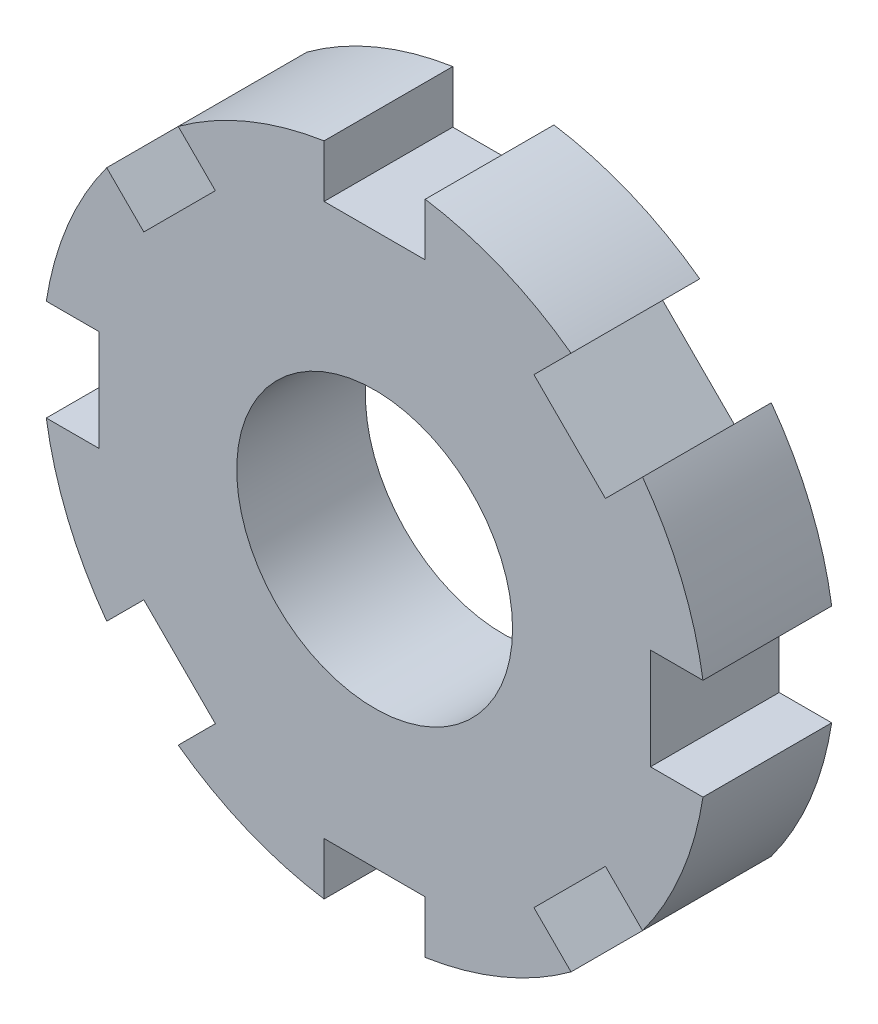
ISO-10303-21;
HEADER;
FILE_DESCRIPTION(('STEP AP214'),'2;1');
FILE_NAME('part.step','',(''),(''),'','','');
FILE_SCHEMA(('AUTOMOTIVE_DESIGN { 1 0 10303 214 1 1 1 1 }'));
ENDSEC;
DATA;
#1=APPLICATION_CONTEXT('core data for automotive mechanical design processes');
#2=APPLICATION_PROTOCOL_DEFINITION('international standard','automotive_design',2000,#1);
#3=PRODUCT_CONTEXT('',#1,'mechanical');
#4=PRODUCT('Part','Part','',(#3));
#5=PRODUCT_RELATED_PRODUCT_CATEGORY('part','',(#4));
#6=PRODUCT_DEFINITION_FORMATION('','',#4);
#7=PRODUCT_DEFINITION_CONTEXT('part definition',#1,'design');
#8=PRODUCT_DEFINITION('design','',#6,#7);
#9=PRODUCT_DEFINITION_SHAPE('','',#8);
#10=(LENGTH_UNIT() NAMED_UNIT(*) SI_UNIT(.MILLI.,.METRE.));
#11=(NAMED_UNIT(*) PLANE_ANGLE_UNIT() SI_UNIT($,.RADIAN.));
#12=(NAMED_UNIT(*) SI_UNIT($,.STERADIAN.) SOLID_ANGLE_UNIT());
#13=UNCERTAINTY_MEASURE_WITH_UNIT(LENGTH_MEASURE(1.E-05),#10,'distance_accuracy_value','');
#14=(GEOMETRIC_REPRESENTATION_CONTEXT(3) GLOBAL_UNCERTAINTY_ASSIGNED_CONTEXT((#13)) GLOBAL_UNIT_ASSIGNED_CONTEXT((#10,
#11,#12)) REPRESENTATION_CONTEXT('',''));
#15=CARTESIAN_POINT('',(0.,0.,0.));
#16=DIRECTION('',(0.,0.,1.));
#17=DIRECTION('',(1.,0.,0.));
#18=AXIS2_PLACEMENT_3D('',#15,#16,#17);
#19=CARTESIAN_POINT('',(5.5,0.,14.));
#20=DIRECTION('',(1.,0.,0.));
#21=DIRECTION('',(0.,1.,0.));
#22=AXIS2_PLACEMENT_3D('',#19,#20,#21);
#23=PLANE('',#22);
#24=DIRECTION('',(0.,0.,1.));
#25=VECTOR('',#24,1.);
#26=CARTESIAN_POINT('',(5.5,-5.70889244992067,0.));
#27=LINE('',#26,#25);
#28=CARTESIAN_POINT('',(5.5,-5.70889244992067,14.));
#29=VERTEX_POINT('',#28);
#30=CARTESIAN_POINT('',(5.5,-5.70889244992067,0.));
#31=VERTEX_POINT('',#30);
#32=EDGE_CURVE('E495',#29,#31,#27,.F.);
#33=ORIENTED_EDGE('',*,*,#32,.F.);
#34=DIRECTION('',(0.,-1.,0.));
#35=VECTOR('',#34,1.);
#36=CARTESIAN_POINT('',(5.5,0.,14.));
#37=LINE('',#36,#35);
#38=CARTESIAN_POINT('',(5.5,0.,14.));
#39=VERTEX_POINT('',#38);
#40=EDGE_CURVE('E305',#39,#29,#37,.T.);
#41=ORIENTED_EDGE('',*,*,#40,.F.);
#42=DIRECTION('',(0.,0.,-1.));
#43=VECTOR('',#42,1.);
#44=CARTESIAN_POINT('',(5.5,0.,14.));
#45=LINE('',#44,#43);
#46=CARTESIAN_POINT('',(5.5,0.,0.));
#47=VERTEX_POINT('',#46);
#48=EDGE_CURVE('E306',#39,#47,#45,.T.);
#49=ORIENTED_EDGE('',*,*,#48,.T.);
#50=DIRECTION('',(0.,-1.,0.));
#51=VECTOR('',#50,1.);
#52=CARTESIAN_POINT('',(5.5,0.,0.));
#53=LINE('',#52,#51);
#54=EDGE_CURVE('E432',#47,#31,#53,.T.);
#55=ORIENTED_EDGE('',*,*,#54,.T.);
#56=EDGE_LOOP('',(#33,#41,#49,#55));
#57=FACE_BOUND('',#56,.T.);
#58=ADVANCED_FACE('F32',(#57),#23,.F.);
#59=CARTESIAN_POINT('',(30.,24.5,14.));
#60=DIRECTION('',(0.,-1.,0.));
#61=DIRECTION('',(1.,0.,0.));
#62=AXIS2_PLACEMENT_3D('',#59,#60,#61);
#63=PLANE('',#62);
#64=DIRECTION('',(0.,0.,1.));
#65=VECTOR('',#64,1.);
#66=CARTESIAN_POINT('',(35.7088924499207,24.5,0.));
#67=LINE('',#66,#65);
#68=CARTESIAN_POINT('',(35.7088924499207,24.5,0.));
#69=VERTEX_POINT('',#68);
#70=CARTESIAN_POINT('',(35.7088924499207,24.5,14.));
#71=VERTEX_POINT('',#70);
#72=EDGE_CURVE('E493',#69,#71,#67,.T.);
#73=ORIENTED_EDGE('',*,*,#72,.F.);
#74=DIRECTION('',(-1.,0.,0.));
#75=VECTOR('',#74,1.);
#76=CARTESIAN_POINT('',(30.,24.5,0.));
#77=LINE('',#76,#75);
#78=CARTESIAN_POINT('',(30.,24.5,0.));
#79=VERTEX_POINT('',#78);
#80=EDGE_CURVE('E443',#69,#79,#77,.T.);
#81=ORIENTED_EDGE('',*,*,#80,.T.);
#82=DIRECTION('',(0.,0.,-1.));
#83=VECTOR('',#82,1.);
#84=CARTESIAN_POINT('',(30.,24.5,14.));
#85=LINE('',#84,#83);
#86=CARTESIAN_POINT('',(30.,24.5,14.));
#87=VERTEX_POINT('',#86);
#88=EDGE_CURVE('E355',#87,#79,#85,.T.);
#89=ORIENTED_EDGE('',*,*,#88,.F.);
#90=DIRECTION('',(-1.,0.,0.));
#91=VECTOR('',#90,1.);
#92=CARTESIAN_POINT('',(30.,24.5,14.));
#93=LINE('',#92,#91);
#94=EDGE_CURVE('E460',#71,#87,#93,.T.);
#95=ORIENTED_EDGE('',*,*,#94,.F.);
#96=EDGE_LOOP('',(#73,#81,#89,#95));
#97=FACE_BOUND('',#96,.T.);
#98=ADVANCED_FACE('F513',(#97),#63,.F.);
#99=CARTESIAN_POINT('',(30.,35.5,14.));
#100=DIRECTION('',(0.,1.,0.));
#101=DIRECTION('',(-1.,0.,0.));
#102=AXIS2_PLACEMENT_3D('',#99,#100,#101);
#103=PLANE('',#102);
#104=DIRECTION('',(0.,0.,1.));
#105=VECTOR('',#104,1.);
#106=CARTESIAN_POINT('',(35.7088924499207,35.5,0.));
#107=LINE('',#106,#105);
#108=CARTESIAN_POINT('',(35.7088924499207,35.5,14.));
#109=VERTEX_POINT('',#108);
#110=CARTESIAN_POINT('',(35.7088924499207,35.5,0.));
#111=VERTEX_POINT('',#110);
#112=EDGE_CURVE('E47',#109,#111,#107,.F.);
#113=ORIENTED_EDGE('',*,*,#112,.F.);
#114=DIRECTION('',(1.,0.,0.));
#115=VECTOR('',#114,1.);
#116=CARTESIAN_POINT('',(30.,35.5,14.));
#117=LINE('',#116,#115);
#118=CARTESIAN_POINT('',(30.,35.5,14.));
#119=VERTEX_POINT('',#118);
#120=EDGE_CURVE('E455',#119,#109,#117,.T.);
#121=ORIENTED_EDGE('',*,*,#120,.F.);
#122=DIRECTION('',(0.,0.,-1.));
#123=VECTOR('',#122,1.);
#124=CARTESIAN_POINT('',(30.,35.5,14.));
#125=LINE('',#124,#123);
#126=CARTESIAN_POINT('',(30.,35.5,0.));
#127=VERTEX_POINT('',#126);
#128=EDGE_CURVE('E256',#119,#127,#125,.T.);
#129=ORIENTED_EDGE('',*,*,#128,.T.);
#130=DIRECTION('',(1.,0.,0.));
#131=VECTOR('',#130,1.);
#132=CARTESIAN_POINT('',(30.,35.5,0.));
#133=LINE('',#132,#131);
#134=EDGE_CURVE('E263',#127,#111,#133,.T.);
#135=ORIENTED_EDGE('',*,*,#134,.T.);
#136=EDGE_LOOP('',(#113,#121,#129,#135));
#137=FACE_BOUND('',#136,.T.);
#138=ADVANCED_FACE('F453',(#137),#103,.F.);
#139=CARTESIAN_POINT('',(5.50000000000001,60.,14.));
#140=DIRECTION('',(1.,0.,0.));
#141=DIRECTION('',(0.,1.,0.));
#142=AXIS2_PLACEMENT_3D('',#139,#140,#141);
#143=PLANE('',#142);
#144=DIRECTION('',(0.,0.,1.));
#145=VECTOR('',#144,1.);
#146=CARTESIAN_POINT('',(5.5,65.7088924499207,0.));
#147=LINE('',#146,#145);
#148=CARTESIAN_POINT('',(5.5,65.7088924499207,0.));
#149=VERTEX_POINT('',#148);
#150=CARTESIAN_POINT('',(5.5,65.7088924499207,14.));
#151=VERTEX_POINT('',#150);
#152=EDGE_CURVE('E490',#149,#151,#147,.T.);
#153=ORIENTED_EDGE('',*,*,#152,.F.);
#154=DIRECTION('',(0.,-1.,0.));
#155=VECTOR('',#154,1.);
#156=CARTESIAN_POINT('',(5.50000000000001,60.,0.));
#157=LINE('',#156,#155);
#158=CARTESIAN_POINT('',(5.50000000000001,60.,0.));
#159=VERTEX_POINT('',#158);
#160=EDGE_CURVE('E273',#149,#159,#157,.T.);
#161=ORIENTED_EDGE('',*,*,#160,.T.);
#162=DIRECTION('',(0.,0.,-1.));
#163=VECTOR('',#162,1.);
#164=CARTESIAN_POINT('',(5.50000000000001,60.,14.));
#165=LINE('',#164,#163);
#166=CARTESIAN_POINT('',(5.50000000000001,60.,14.));
#167=VERTEX_POINT('',#166);
#168=EDGE_CURVE('E344',#167,#159,#165,.T.);
#169=ORIENTED_EDGE('',*,*,#168,.F.);
#170=DIRECTION('',(0.,-1.,0.));
#171=VECTOR('',#170,1.);
#172=CARTESIAN_POINT('',(5.50000000000001,60.,14.));
#173=LINE('',#172,#171);
#174=EDGE_CURVE('E468',#151,#167,#173,.T.);
#175=ORIENTED_EDGE('',*,*,#174,.F.);
#176=EDGE_LOOP('',(#153,#161,#169,#175));
#177=FACE_BOUND('',#176,.T.);
#178=ADVANCED_FACE('F582',(#177),#143,.F.);
#179=CARTESIAN_POINT('',(-5.50000000000001,60.,14.));
#180=DIRECTION('',(-1.,0.,0.));
#181=DIRECTION('',(0.,-1.,0.));
#182=AXIS2_PLACEMENT_3D('',#179,#180,#181);
#183=PLANE('',#182);
#184=DIRECTION('',(0.,0.,1.));
#185=VECTOR('',#184,1.);
#186=CARTESIAN_POINT('',(-5.5,65.7088924499207,0.));
#187=LINE('',#186,#185);
#188=CARTESIAN_POINT('',(-5.5,65.7088924499207,14.));
#189=VERTEX_POINT('',#188);
#190=CARTESIAN_POINT('',(-5.5,65.7088924499207,0.));
#191=VERTEX_POINT('',#190);
#192=EDGE_CURVE('E55',#189,#191,#187,.F.);
#193=ORIENTED_EDGE('',*,*,#192,.F.);
#194=DIRECTION('',(0.,1.,0.));
#195=VECTOR('',#194,1.);
#196=CARTESIAN_POINT('',(-5.50000000000001,60.,14.));
#197=LINE('',#196,#195);
#198=CARTESIAN_POINT('',(-5.50000000000001,60.,14.));
#199=VERTEX_POINT('',#198);
#200=EDGE_CURVE('E472',#199,#189,#197,.T.);
#201=ORIENTED_EDGE('',*,*,#200,.F.);
#202=DIRECTION('',(0.,0.,-1.));
#203=VECTOR('',#202,1.);
#204=CARTESIAN_POINT('',(-5.50000000000001,60.,14.));
#205=LINE('',#204,#203);
#206=CARTESIAN_POINT('',(-5.50000000000001,60.,0.));
#207=VERTEX_POINT('',#206);
#208=EDGE_CURVE('E341',#199,#207,#205,.T.);
#209=ORIENTED_EDGE('',*,*,#208,.T.);
#210=DIRECTION('',(0.,1.,0.));
#211=VECTOR('',#210,1.);
#212=CARTESIAN_POINT('',(-5.50000000000001,60.,0.));
#213=LINE('',#212,#211);
#214=EDGE_CURVE('E277',#207,#191,#213,.T.);
#215=ORIENTED_EDGE('',*,*,#214,.T.);
#216=EDGE_LOOP('',(#193,#201,#209,#215));
#217=FACE_BOUND('',#216,.T.);
#218=ADVANCED_FACE('F622',(#217),#183,.F.);
#219=CARTESIAN_POINT('',(-30.,35.5,14.));
#220=DIRECTION('',(0.,1.,0.));
#221=DIRECTION('',(-1.,0.,0.));
#222=AXIS2_PLACEMENT_3D('',#219,#220,#221);
#223=PLANE('',#222);
#224=DIRECTION('',(0.,0.,1.));
#225=VECTOR('',#224,1.);
#226=CARTESIAN_POINT('',(-35.7088924499207,35.5,0.));
#227=LINE('',#226,#225);
#228=CARTESIAN_POINT('',(-35.7088924499207,35.5,0.));
#229=VERTEX_POINT('',#228);
#230=CARTESIAN_POINT('',(-35.7088924499207,35.5,14.));
#231=VERTEX_POINT('',#230);
#232=EDGE_CURVE('E487',#229,#231,#227,.T.);
#233=ORIENTED_EDGE('',*,*,#232,.F.);
#234=DIRECTION('',(1.,0.,0.));
#235=VECTOR('',#234,1.);
#236=CARTESIAN_POINT('',(-30.,35.5,0.));
#237=LINE('',#236,#235);
#238=CARTESIAN_POINT('',(-30.,35.5,0.));
#239=VERTEX_POINT('',#238);
#240=EDGE_CURVE('E287',#229,#239,#237,.T.);
#241=ORIENTED_EDGE('',*,*,#240,.T.);
#242=DIRECTION('',(0.,0.,-1.));
#243=VECTOR('',#242,1.);
#244=CARTESIAN_POINT('',(-30.,35.5,14.));
#245=LINE('',#244,#243);
#246=CARTESIAN_POINT('',(-30.,35.5,14.));
#247=VERTEX_POINT('',#246);
#248=EDGE_CURVE('E327',#247,#239,#245,.T.);
#249=ORIENTED_EDGE('',*,*,#248,.F.);
#250=DIRECTION('',(1.,0.,0.));
#251=VECTOR('',#250,1.);
#252=CARTESIAN_POINT('',(-30.,35.5,14.));
#253=LINE('',#252,#251);
#254=EDGE_CURVE('E410',#231,#247,#253,.T.);
#255=ORIENTED_EDGE('',*,*,#254,.F.);
#256=EDGE_LOOP('',(#233,#241,#249,#255));
#257=FACE_BOUND('',#256,.T.);
#258=ADVANCED_FACE('F615',(#257),#223,.F.);
#259=CARTESIAN_POINT('',(-30.,24.5,14.));
#260=DIRECTION('',(0.,-1.,0.));
#261=DIRECTION('',(1.,0.,0.));
#262=AXIS2_PLACEMENT_3D('',#259,#260,#261);
#263=PLANE('',#262);
#264=DIRECTION('',(0.,0.,1.));
#265=VECTOR('',#264,1.);
#266=CARTESIAN_POINT('',(-35.7088924499207,24.5,0.));
#267=LINE('',#266,#265);
#268=CARTESIAN_POINT('',(-35.7088924499207,24.5,14.));
#269=VERTEX_POINT('',#268);
#270=CARTESIAN_POINT('',(-35.7088924499207,24.5,0.));
#271=VERTEX_POINT('',#270);
#272=EDGE_CURVE('E485',#269,#271,#267,.F.);
#273=ORIENTED_EDGE('',*,*,#272,.F.);
#274=DIRECTION('',(-1.,0.,0.));
#275=VECTOR('',#274,1.);
#276=CARTESIAN_POINT('',(-30.,24.5,14.));
#277=LINE('',#276,#275);
#278=CARTESIAN_POINT('',(-30.,24.5,14.));
#279=VERTEX_POINT('',#278);
#280=EDGE_CURVE('E419',#279,#269,#277,.T.);
#281=ORIENTED_EDGE('',*,*,#280,.F.);
#282=DIRECTION('',(0.,0.,-1.));
#283=VECTOR('',#282,1.);
#284=CARTESIAN_POINT('',(-30.,24.5,14.));
#285=LINE('',#284,#283);
#286=CARTESIAN_POINT('',(-30.,24.5,0.));
#287=VERTEX_POINT('',#286);
#288=EDGE_CURVE('E324',#279,#287,#285,.T.);
#289=ORIENTED_EDGE('',*,*,#288,.T.);
#290=DIRECTION('',(-1.,0.,0.));
#291=VECTOR('',#290,1.);
#292=CARTESIAN_POINT('',(-30.,24.5,0.));
#293=LINE('',#292,#291);
#294=EDGE_CURVE('E291',#287,#271,#293,.T.);
#295=ORIENTED_EDGE('',*,*,#294,.T.);
#296=EDGE_LOOP('',(#273,#281,#289,#295));
#297=FACE_BOUND('',#296,.T.);
#298=ADVANCED_FACE('F605',(#297),#263,.F.);
#299=CARTESIAN_POINT('',(-5.49999999999998,0.,14.));
#300=DIRECTION('',(-1.,0.,0.));
#301=DIRECTION('',(0.,-1.,0.));
#302=AXIS2_PLACEMENT_3D('',#299,#300,#301);
#303=PLANE('',#302);
#304=DIRECTION('',(0.,0.,1.));
#305=VECTOR('',#304,1.);
#306=CARTESIAN_POINT('',(-5.49999999999998,-5.70889244992067,0.));
#307=LINE('',#306,#305);
#308=CARTESIAN_POINT('',(-5.49999999999998,-5.70889244992067,0.));
#309=VERTEX_POINT('',#308);
#310=CARTESIAN_POINT('',(-5.49999999999998,-5.70889244992067,14.));
#311=VERTEX_POINT('',#310);
#312=EDGE_CURVE('E246',#309,#311,#307,.T.);
#313=ORIENTED_EDGE('',*,*,#312,.F.);
#314=DIRECTION('',(0.,1.,0.));
#315=VECTOR('',#314,1.);
#316=CARTESIAN_POINT('',(-5.49999999999998,0.,0.));
#317=LINE('',#316,#315);
#318=CARTESIAN_POINT('',(-5.49999999999998,0.,0.));
#319=VERTEX_POINT('',#318);
#320=EDGE_CURVE('E301',#309,#319,#317,.T.);
#321=ORIENTED_EDGE('',*,*,#320,.T.);
#322=DIRECTION('',(0.,0.,-1.));
#323=VECTOR('',#322,1.);
#324=CARTESIAN_POINT('',(-5.49999999999998,0.,14.));
#325=LINE('',#324,#323);
#326=CARTESIAN_POINT('',(-5.49999999999998,0.,14.));
#327=VERTEX_POINT('',#326);
#328=EDGE_CURVE('E309',#327,#319,#325,.T.);
#329=ORIENTED_EDGE('',*,*,#328,.F.);
#330=DIRECTION('',(0.,1.,0.));
#331=VECTOR('',#330,1.);
#332=CARTESIAN_POINT('',(-5.49999999999998,0.,14.));
#333=LINE('',#332,#331);
#334=EDGE_CURVE('E429',#311,#327,#333,.T.);
#335=ORIENTED_EDGE('',*,*,#334,.F.);
#336=EDGE_LOOP('',(#313,#321,#329,#335));
#337=FACE_BOUND('',#336,.T.);
#338=ADVANCED_FACE('F557',(#337),#303,.F.);
#339=CARTESIAN_POINT('',(0.,0.,14.));
#340=DIRECTION('',(0.,0.,1.));
#341=DIRECTION('',(1.,0.,0.));
#342=AXIS2_PLACEMENT_3D('',#339,#340,#341);
#343=PLANE('',#342);
#344=CARTESIAN_POINT('',(0.,30.,14.));
#345=DIRECTION('',(0.,0.,1.));
#346=DIRECTION('',(1.,0.,0.));
#347=AXIS2_PLACEMENT_3D('',#344,#345,#346);
#348=CIRCLE('',#347,15.);
#349=CARTESIAN_POINT('',(15.,30.,14.));
#350=VERTEX_POINT('',#349);
#351=EDGE_CURVE('E436',#350,#350,#348,.T.);
#352=ORIENTED_EDGE('',*,*,#351,.F.);
#353=EDGE_LOOP('',(#352));
#354=FACE_BOUND('',#353,.T.);
#355=ORIENTED_EDGE('',*,*,#120,.T.);
#356=CARTESIAN_POINT('',(0.,30.,14.));
#357=DIRECTION('',(0.,0.,1.));
#358=DIRECTION('',(1.,0.,0.));
#359=AXIS2_PLACEMENT_3D('',#356,#357,#358);
#360=CIRCLE('',#359,36.1299737060519);
#361=CARTESIAN_POINT('',(29.139087296526,51.360912703474,14.));
#362=VERTEX_POINT('',#361);
#363=EDGE_CURVE('E247',#109,#362,#360,.T.);
#364=ORIENTED_EDGE('',*,*,#363,.T.);
#365=DIRECTION('',(-0.707106781186547,-0.707106781186548,0.));
#366=VECTOR('',#365,1.);
#367=CARTESIAN_POINT('',(29.139087296526,51.360912703474,14.));
#368=LINE('',#367,#366);
#369=CARTESIAN_POINT('',(25.1022907321224,47.3241161390704,14.));
#370=VERTEX_POINT('',#369);
#371=EDGE_CURVE('E255',#362,#370,#368,.T.);
#372=ORIENTED_EDGE('',*,*,#371,.T.);
#373=DIRECTION('',(-0.707106781186548,0.707106781186547,0.));
#374=VECTOR('',#373,1.);
#375=CARTESIAN_POINT('',(17.3241161390704,55.1022907321224,14.));
#376=LINE('',#375,#374);
#377=CARTESIAN_POINT('',(17.3241161390704,55.1022907321224,14.));
#378=VERTEX_POINT('',#377);
#379=EDGE_CURVE('E458',#370,#378,#376,.T.);
#380=ORIENTED_EDGE('',*,*,#379,.T.);
#381=DIRECTION('',(0.707106781186548,0.707106781186547,0.));
#382=VECTOR('',#381,1.);
#383=CARTESIAN_POINT('',(21.360912703474,59.139087296526,14.));
#384=LINE('',#383,#382);
#385=CARTESIAN_POINT('',(21.360912703474,59.139087296526,14.));
#386=VERTEX_POINT('',#385);
#387=EDGE_CURVE('E465',#378,#386,#384,.T.);
#388=ORIENTED_EDGE('',*,*,#387,.T.);
#389=EDGE_CURVE('E477',#386,#151,#360,.T.);
#390=ORIENTED_EDGE('',*,*,#389,.T.);
#391=ORIENTED_EDGE('',*,*,#174,.T.);
#392=DIRECTION('',(-1.,0.,0.));
#393=VECTOR('',#392,1.);
#394=CARTESIAN_POINT('',(-5.50000000000001,60.,14.));
#395=LINE('',#394,#393);
#396=EDGE_CURVE('E470',#167,#199,#395,.T.);
#397=ORIENTED_EDGE('',*,*,#396,.T.);
#398=ORIENTED_EDGE('',*,*,#200,.T.);
#399=CARTESIAN_POINT('',(-21.360912703474,59.139087296526,14.));
#400=VERTEX_POINT('',#399);
#401=EDGE_CURVE('E475',#189,#400,#360,.T.);
#402=ORIENTED_EDGE('',*,*,#401,.T.);
#403=DIRECTION('',(0.707106781186548,-0.707106781186547,0.));
#404=VECTOR('',#403,1.);
#405=CARTESIAN_POINT('',(-21.360912703474,59.139087296526,14.));
#406=LINE('',#405,#404);
#407=CARTESIAN_POINT('',(-17.3241161390704,55.1022907321224,14.));
#408=VERTEX_POINT('',#407);
#409=EDGE_CURVE('E395',#400,#408,#406,.T.);
#410=ORIENTED_EDGE('',*,*,#409,.T.);
#411=DIRECTION('',(-0.707106781186548,-0.707106781186547,0.));
#412=VECTOR('',#411,1.);
#413=CARTESIAN_POINT('',(-17.3241161390704,55.1022907321224,14.));
#414=LINE('',#413,#412);
#415=CARTESIAN_POINT('',(-25.1022907321224,47.3241161390704,14.));
#416=VERTEX_POINT('',#415);
#417=EDGE_CURVE('E411',#408,#416,#414,.T.);
#418=ORIENTED_EDGE('',*,*,#417,.T.);
#419=DIRECTION('',(-0.707106781186547,0.707106781186548,0.));
#420=VECTOR('',#419,1.);
#421=CARTESIAN_POINT('',(-29.139087296526,51.360912703474,14.));
#422=LINE('',#421,#420);
#423=CARTESIAN_POINT('',(-29.139087296526,51.360912703474,14.));
#424=VERTEX_POINT('',#423);
#425=EDGE_CURVE('E407',#416,#424,#422,.T.);
#426=ORIENTED_EDGE('',*,*,#425,.T.);
#427=EDGE_CURVE('E478',#424,#231,#360,.T.);
#428=ORIENTED_EDGE('',*,*,#427,.T.);
#429=ORIENTED_EDGE('',*,*,#254,.T.);
#430=DIRECTION('',(0.,-1.,0.));
#431=VECTOR('',#430,1.);
#432=CARTESIAN_POINT('',(-30.,35.5,14.));
#433=LINE('',#432,#431);
#434=EDGE_CURVE('E413',#247,#279,#433,.T.);
#435=ORIENTED_EDGE('',*,*,#434,.T.);
#436=ORIENTED_EDGE('',*,*,#280,.T.);
#437=CARTESIAN_POINT('',(-29.139087296526,8.63908729652599,14.));
#438=VERTEX_POINT('',#437);
#439=EDGE_CURVE('E481',#269,#438,#360,.T.);
#440=ORIENTED_EDGE('',*,*,#439,.T.);
#441=DIRECTION('',(0.707106781186547,0.707106781186548,0.));
#442=VECTOR('',#441,1.);
#443=CARTESIAN_POINT('',(-29.139087296526,8.63908729652601,14.));
#444=LINE('',#443,#442);
#445=CARTESIAN_POINT('',(-25.1022907321224,12.6758838609296,14.));
#446=VERTEX_POINT('',#445);
#447=EDGE_CURVE('E422',#438,#446,#444,.T.);
#448=ORIENTED_EDGE('',*,*,#447,.T.);
#449=DIRECTION('',(0.707106781186547,-0.707106781186548,0.));
#450=VECTOR('',#449,1.);
#451=CARTESIAN_POINT('',(-17.3241161390704,4.89770926787757,14.));
#452=LINE('',#451,#450);
#453=CARTESIAN_POINT('',(-17.3241161390704,4.89770926787757,14.));
#454=VERTEX_POINT('',#453);
#455=EDGE_CURVE('E424',#446,#454,#452,.T.);
#456=ORIENTED_EDGE('',*,*,#455,.T.);
#457=DIRECTION('',(-0.707106781186548,-0.707106781186547,0.));
#458=VECTOR('',#457,1.);
#459=CARTESIAN_POINT('',(-21.360912703474,0.860912703474,14.));
#460=LINE('',#459,#458);
#461=CARTESIAN_POINT('',(-21.360912703474,0.860912703473979,14.));
#462=VERTEX_POINT('',#461);
#463=EDGE_CURVE('E426',#454,#462,#460,.T.);
#464=ORIENTED_EDGE('',*,*,#463,.T.);
#465=EDGE_CURVE('E531',#462,#311,#360,.T.);
#466=ORIENTED_EDGE('',*,*,#465,.T.);
#467=ORIENTED_EDGE('',*,*,#334,.T.);
#468=DIRECTION('',(1.,0.,0.));
#469=VECTOR('',#468,1.);
#470=CARTESIAN_POINT('',(-5.49999999999998,0.,14.));
#471=LINE('',#470,#469);
#472=EDGE_CURVE('E310',#327,#39,#471,.T.);
#473=ORIENTED_EDGE('',*,*,#472,.T.);
#474=ORIENTED_EDGE('',*,*,#40,.T.);
#475=CARTESIAN_POINT('',(21.360912703474,0.860912703473979,14.));
#476=VERTEX_POINT('',#475);
#477=EDGE_CURVE('E528',#29,#476,#360,.T.);
#478=ORIENTED_EDGE('',*,*,#477,.T.);
#479=DIRECTION('',(-0.707106781186548,0.707106781186547,0.));
#480=VECTOR('',#479,1.);
#481=CARTESIAN_POINT('',(21.360912703474,0.860912703473978,14.));
#482=LINE('',#481,#480);
#483=CARTESIAN_POINT('',(17.3241161390704,4.89770926787756,14.));
#484=VERTEX_POINT('',#483);
#485=EDGE_CURVE('E504',#476,#484,#482,.T.);
#486=ORIENTED_EDGE('',*,*,#485,.T.);
#487=DIRECTION('',(0.707106781186548,0.707106781186548,0.));
#488=VECTOR('',#487,1.);
#489=CARTESIAN_POINT('',(17.3241161390704,4.89770926787756,14.));
#490=LINE('',#489,#488);
#491=CARTESIAN_POINT('',(25.1022907321224,12.6758838609296,14.));
#492=VERTEX_POINT('',#491);
#493=EDGE_CURVE('E506',#484,#492,#490,.T.);
#494=ORIENTED_EDGE('',*,*,#493,.T.);
#495=DIRECTION('',(0.707106781186547,-0.707106781186548,0.));
#496=VECTOR('',#495,1.);
#497=CARTESIAN_POINT('',(29.139087296526,8.63908729652599,14.));
#498=LINE('',#497,#496);
#499=CARTESIAN_POINT('',(29.139087296526,8.63908729652599,14.));
#500=VERTEX_POINT('',#499);
#501=EDGE_CURVE('E508',#492,#500,#498,.T.);
#502=ORIENTED_EDGE('',*,*,#501,.T.);
#503=EDGE_CURVE('E483',#500,#71,#360,.T.);
#504=ORIENTED_EDGE('',*,*,#503,.T.);
#505=ORIENTED_EDGE('',*,*,#94,.T.);
#506=DIRECTION('',(0.,1.,0.));
#507=VECTOR('',#506,1.);
#508=CARTESIAN_POINT('',(30.,35.5,14.));
#509=LINE('',#508,#507);
#510=EDGE_CURVE('E456',#87,#119,#509,.T.);
#511=ORIENTED_EDGE('',*,*,#510,.T.);
#512=EDGE_LOOP('',(#355,#364,#372,#380,#388,#390,#391,#397,#398,#402,#410,#418,#426,#428,#429,
#435,#436,#440,#448,#456,#464,#466,#467,#473,#474,#478,#486,#494,#502,#504,#505,#511));
#513=FACE_BOUND('',#512,.T.);
#514=ADVANCED_FACE('F474',(#354,#513),#343,.T.);
#515=CARTESIAN_POINT('',(0.,0.,0.));
#516=DIRECTION('',(0.,0.,1.));
#517=DIRECTION('',(1.,0.,0.));
#518=AXIS2_PLACEMENT_3D('',#515,#516,#517);
#519=PLANE('',#518);
#520=CARTESIAN_POINT('',(0.,30.,0.));
#521=DIRECTION('',(0.,0.,1.));
#522=DIRECTION('',(1.,0.,0.));
#523=AXIS2_PLACEMENT_3D('',#520,#521,#522);
#524=CIRCLE('',#523,15.);
#525=CARTESIAN_POINT('',(15.,30.,0.));
#526=VERTEX_POINT('',#525);
#527=EDGE_CURVE('E497',#526,#526,#524,.T.);
#528=ORIENTED_EDGE('',*,*,#527,.T.);
#529=EDGE_LOOP('',(#528));
#530=FACE_BOUND('',#529,.T.);
#531=CARTESIAN_POINT('',(0.,30.,0.));
#532=DIRECTION('',(0.,0.,1.));
#533=DIRECTION('',(1.,0.,0.));
#534=AXIS2_PLACEMENT_3D('',#531,#532,#533);
#535=CIRCLE('',#534,36.1299737060519);
#536=CARTESIAN_POINT('',(29.1390872965261,51.3609127034739,0.));
#537=VERTEX_POINT('',#536);
#538=EDGE_CURVE('E237',#111,#537,#535,.T.);
#539=ORIENTED_EDGE('',*,*,#538,.F.);
#540=ORIENTED_EDGE('',*,*,#134,.F.);
#541=DIRECTION('',(0.,1.,0.));
#542=VECTOR('',#541,1.);
#543=CARTESIAN_POINT('',(30.,35.5,0.));
#544=LINE('',#543,#542);
#545=EDGE_CURVE('E267',#79,#127,#544,.T.);
#546=ORIENTED_EDGE('',*,*,#545,.F.);
#547=ORIENTED_EDGE('',*,*,#80,.F.);
#548=CARTESIAN_POINT('',(0.,30.,0.));
#549=DIRECTION('',(0.,0.,1.));
#550=DIRECTION('',(1.,0.,0.));
#551=AXIS2_PLACEMENT_3D('',#548,#549,#550);
#552=CIRCLE('',#551,36.1299737060519);
#553=CARTESIAN_POINT('',(29.139087296526,8.63908729652599,0.));
#554=VERTEX_POINT('',#553);
#555=EDGE_CURVE('E35',#554,#69,#552,.T.);
#556=ORIENTED_EDGE('',*,*,#555,.F.);
#557=DIRECTION('',(0.707106781186547,-0.707106781186548,0.));
#558=VECTOR('',#557,1.);
#559=CARTESIAN_POINT('',(29.139087296526,8.63908729652599,0.));
#560=LINE('',#559,#558);
#561=CARTESIAN_POINT('',(25.1022907321224,12.6758838609296,0.));
#562=VERTEX_POINT('',#561);
#563=EDGE_CURVE('E440',#562,#554,#560,.T.);
#564=ORIENTED_EDGE('',*,*,#563,.F.);
#565=DIRECTION('',(0.707106781186548,0.707106781186548,0.));
#566=VECTOR('',#565,1.);
#567=CARTESIAN_POINT('',(17.3241161390704,4.89770926787756,0.));
#568=LINE('',#567,#566);
#569=CARTESIAN_POINT('',(17.3241161390704,4.89770926787756,0.));
#570=VERTEX_POINT('',#569);
#571=EDGE_CURVE('E438',#570,#562,#568,.T.);
#572=ORIENTED_EDGE('',*,*,#571,.F.);
#573=DIRECTION('',(-0.707106781186548,0.707106781186547,0.));
#574=VECTOR('',#573,1.);
#575=CARTESIAN_POINT('',(21.360912703474,0.860912703473978,0.));
#576=LINE('',#575,#574);
#577=CARTESIAN_POINT('',(21.360912703474,0.860912703473968,0.));
#578=VERTEX_POINT('',#577);
#579=EDGE_CURVE('E435',#578,#570,#576,.T.);
#580=ORIENTED_EDGE('',*,*,#579,.F.);
#581=EDGE_CURVE('E370',#31,#578,#552,.T.);
#582=ORIENTED_EDGE('',*,*,#581,.F.);
#583=ORIENTED_EDGE('',*,*,#54,.F.);
#584=DIRECTION('',(1.,0.,0.));
#585=VECTOR('',#584,1.);
#586=CARTESIAN_POINT('',(-5.49999999999998,0.,0.));
#587=LINE('',#586,#585);
#588=EDGE_CURVE('E303',#319,#47,#587,.T.);
#589=ORIENTED_EDGE('',*,*,#588,.F.);
#590=ORIENTED_EDGE('',*,*,#320,.F.);
#591=CARTESIAN_POINT('',(-21.360912703474,0.860912703474,0.));
#592=VERTEX_POINT('',#591);
#593=EDGE_CURVE('E374',#592,#309,#552,.T.);
#594=ORIENTED_EDGE('',*,*,#593,.F.);
#595=DIRECTION('',(-0.707106781186548,-0.707106781186547,0.));
#596=VECTOR('',#595,1.);
#597=CARTESIAN_POINT('',(-21.360912703474,0.860912703474,0.));
#598=LINE('',#597,#596);
#599=CARTESIAN_POINT('',(-17.3241161390704,4.89770926787757,0.));
#600=VERTEX_POINT('',#599);
#601=EDGE_CURVE('E298',#600,#592,#598,.T.);
#602=ORIENTED_EDGE('',*,*,#601,.F.);
#603=DIRECTION('',(0.707106781186547,-0.707106781186548,0.));
#604=VECTOR('',#603,1.);
#605=CARTESIAN_POINT('',(-17.3241161390704,4.89770926787757,0.));
#606=LINE('',#605,#604);
#607=CARTESIAN_POINT('',(-25.1022907321224,12.6758838609296,0.));
#608=VERTEX_POINT('',#607);
#609=EDGE_CURVE('E296',#608,#600,#606,.T.);
#610=ORIENTED_EDGE('',*,*,#609,.F.);
#611=DIRECTION('',(0.707106781186547,0.707106781186548,0.));
#612=VECTOR('',#611,1.);
#613=CARTESIAN_POINT('',(-29.139087296526,8.63908729652601,0.));
#614=LINE('',#613,#612);
#615=CARTESIAN_POINT('',(-29.1390872965261,8.63908729652611,0.));
#616=VERTEX_POINT('',#615);
#617=EDGE_CURVE('E294',#616,#608,#614,.T.);
#618=ORIENTED_EDGE('',*,*,#617,.F.);
#619=EDGE_CURVE('E377',#271,#616,#552,.T.);
#620=ORIENTED_EDGE('',*,*,#619,.F.);
#621=ORIENTED_EDGE('',*,*,#294,.F.);
#622=DIRECTION('',(0.,-1.,0.));
#623=VECTOR('',#622,1.);
#624=CARTESIAN_POINT('',(-30.,35.5,0.));
#625=LINE('',#624,#623);
#626=EDGE_CURVE('E289',#239,#287,#625,.T.);
#627=ORIENTED_EDGE('',*,*,#626,.F.);
#628=ORIENTED_EDGE('',*,*,#240,.F.);
#629=CARTESIAN_POINT('',(-29.139087296526,51.360912703474,0.));
#630=VERTEX_POINT('',#629);
#631=EDGE_CURVE('E381',#630,#229,#552,.T.);
#632=ORIENTED_EDGE('',*,*,#631,.F.);
#633=DIRECTION('',(-0.707106781186547,0.707106781186548,0.));
#634=VECTOR('',#633,1.);
#635=CARTESIAN_POINT('',(-29.139087296526,51.360912703474,0.));
#636=LINE('',#635,#634);
#637=CARTESIAN_POINT('',(-25.1022907321224,47.3241161390704,0.));
#638=VERTEX_POINT('',#637);
#639=EDGE_CURVE('E284',#638,#630,#636,.T.);
#640=ORIENTED_EDGE('',*,*,#639,.F.);
#641=DIRECTION('',(-0.707106781186548,-0.707106781186547,0.));
#642=VECTOR('',#641,1.);
#643=CARTESIAN_POINT('',(-17.3241161390704,55.1022907321224,0.));
#644=LINE('',#643,#642);
#645=CARTESIAN_POINT('',(-17.3241161390704,55.1022907321224,0.));
#646=VERTEX_POINT('',#645);
#647=EDGE_CURVE('E282',#646,#638,#644,.T.);
#648=ORIENTED_EDGE('',*,*,#647,.F.);
#649=DIRECTION('',(0.707106781186548,-0.707106781186547,0.));
#650=VECTOR('',#649,1.);
#651=CARTESIAN_POINT('',(-21.360912703474,59.139087296526,0.));
#652=LINE('',#651,#650);
#653=CARTESIAN_POINT('',(-21.360912703474,59.139087296526,0.));
#654=VERTEX_POINT('',#653);
#655=EDGE_CURVE('E280',#654,#646,#652,.T.);
#656=ORIENTED_EDGE('',*,*,#655,.F.);
#657=EDGE_CURVE('E40',#191,#654,#552,.T.);
#658=ORIENTED_EDGE('',*,*,#657,.F.);
#659=ORIENTED_EDGE('',*,*,#214,.F.);
#660=DIRECTION('',(-1.,0.,0.));
#661=VECTOR('',#660,1.);
#662=CARTESIAN_POINT('',(-5.50000000000001,60.,0.));
#663=LINE('',#662,#661);
#664=EDGE_CURVE('E275',#159,#207,#663,.T.);
#665=ORIENTED_EDGE('',*,*,#664,.F.);
#666=ORIENTED_EDGE('',*,*,#160,.F.);
#667=CARTESIAN_POINT('',(21.360912703474,59.139087296526,0.));
#668=VERTEX_POINT('',#667);
#669=EDGE_CURVE('E11',#668,#149,#552,.T.);
#670=ORIENTED_EDGE('',*,*,#669,.F.);
#671=DIRECTION('',(0.707106781186548,0.707106781186547,0.));
#672=VECTOR('',#671,1.);
#673=CARTESIAN_POINT('',(21.360912703474,59.139087296526,0.));
#674=LINE('',#673,#672);
#675=CARTESIAN_POINT('',(17.3241161390704,55.1022907321224,0.));
#676=VERTEX_POINT('',#675);
#677=EDGE_CURVE('E265',#676,#668,#674,.T.);
#678=ORIENTED_EDGE('',*,*,#677,.F.);
#679=DIRECTION('',(-0.707106781186548,0.707106781186547,0.));
#680=VECTOR('',#679,1.);
#681=CARTESIAN_POINT('',(17.3241161390704,55.1022907321224,0.));
#682=LINE('',#681,#680);
#683=CARTESIAN_POINT('',(25.1022907321224,47.3241161390704,0.));
#684=VERTEX_POINT('',#683);
#685=EDGE_CURVE('E262',#684,#676,#682,.T.);
#686=ORIENTED_EDGE('',*,*,#685,.F.);
#687=DIRECTION('',(-0.707106781186547,-0.707106781186548,0.));
#688=VECTOR('',#687,1.);
#689=CARTESIAN_POINT('',(29.139087296526,51.360912703474,0.));
#690=LINE('',#689,#688);
#691=EDGE_CURVE('E253',#537,#684,#690,.T.);
#692=ORIENTED_EDGE('',*,*,#691,.F.);
#693=EDGE_LOOP('',(#539,#540,#546,#547,#556,#564,#572,#580,#582,#583,#589,#590,#594,#602,#610,
#618,#620,#621,#627,#628,#632,#640,#648,#656,#658,#659,#665,#666,#670,#678,#686,#692));
#694=FACE_BOUND('',#693,.T.);
#695=ADVANCED_FACE('F260',(#530,#694),#519,.F.);
#696=CARTESIAN_POINT('',(21.360912703474,0.860912703473978,14.));
#697=DIRECTION('',(-0.707106781186547,-0.707106781186548,0.));
#698=DIRECTION('',(0.707106781186548,-0.707106781186547,0.));
#699=AXIS2_PLACEMENT_3D('',#696,#697,#698);
#700=PLANE('',#699);
#701=ORIENTED_EDGE('',*,*,#579,.T.);
#702=DIRECTION('',(0.,0.,-1.));
#703=VECTOR('',#702,1.);
#704=CARTESIAN_POINT('',(17.3241161390704,4.89770926787756,14.));
#705=LINE('',#704,#703);
#706=EDGE_CURVE('E363',#484,#570,#705,.T.);
#707=ORIENTED_EDGE('',*,*,#706,.F.);
#708=ORIENTED_EDGE('',*,*,#485,.F.);
#709=DIRECTION('',(0.,0.,-1.));
#710=VECTOR('',#709,1.);
#711=CARTESIAN_POINT('',(21.360912703474,0.860912703473978,14.));
#712=LINE('',#711,#710);
#713=EDGE_CURVE('E365',#476,#578,#712,.T.);
#714=ORIENTED_EDGE('',*,*,#713,.T.);
#715=EDGE_LOOP('',(#701,#707,#708,#714));
#716=FACE_BOUND('',#715,.T.);
#717=ADVANCED_FACE('F526',(#716),#700,.F.);
#718=CARTESIAN_POINT('',(17.3241161390704,4.89770926787756,14.));
#719=DIRECTION('',(-0.707106781186548,0.707106781186547,0.));
#720=DIRECTION('',(-0.707106781186547,-0.707106781186548,0.));
#721=AXIS2_PLACEMENT_3D('',#718,#719,#720);
#722=PLANE('',#721);
#723=ORIENTED_EDGE('',*,*,#571,.T.);
#724=DIRECTION('',(0.,0.,-1.));
#725=VECTOR('',#724,1.);
#726=CARTESIAN_POINT('',(25.1022907321224,12.6758838609296,14.));
#727=LINE('',#726,#725);
#728=EDGE_CURVE('E360',#492,#562,#727,.T.);
#729=ORIENTED_EDGE('',*,*,#728,.F.);
#730=ORIENTED_EDGE('',*,*,#493,.F.);
#731=ORIENTED_EDGE('',*,*,#706,.T.);
#732=EDGE_LOOP('',(#723,#729,#730,#731));
#733=FACE_BOUND('',#732,.T.);
#734=ADVANCED_FACE('F523',(#733),#722,.F.);
#735=CARTESIAN_POINT('',(29.139087296526,8.63908729652599,14.));
#736=DIRECTION('',(0.707106781186548,0.707106781186547,0.));
#737=DIRECTION('',(-0.707106781186547,0.707106781186548,0.));
#738=AXIS2_PLACEMENT_3D('',#735,#736,#737);
#739=PLANE('',#738);
#740=ORIENTED_EDGE('',*,*,#563,.T.);
#741=DIRECTION('',(0.,0.,-1.));
#742=VECTOR('',#741,1.);
#743=CARTESIAN_POINT('',(29.139087296526,8.63908729652599,14.));
#744=LINE('',#743,#742);
#745=EDGE_CURVE('E358',#500,#554,#744,.T.);
#746=ORIENTED_EDGE('',*,*,#745,.F.);
#747=ORIENTED_EDGE('',*,*,#501,.F.);
#748=ORIENTED_EDGE('',*,*,#728,.T.);
#749=EDGE_LOOP('',(#740,#746,#747,#748));
#750=FACE_BOUND('',#749,.T.);
#751=ADVANCED_FACE('F518',(#750),#739,.F.);
#752=CARTESIAN_POINT('',(30.,35.5,14.));
#753=DIRECTION('',(-1.,0.,0.));
#754=DIRECTION('',(0.,0.,1.));
#755=AXIS2_PLACEMENT_3D('',#752,#753,#754);
#756=PLANE('',#755);
#757=ORIENTED_EDGE('',*,*,#545,.T.);
#758=ORIENTED_EDGE('',*,*,#128,.F.);
#759=ORIENTED_EDGE('',*,*,#510,.F.);
#760=ORIENTED_EDGE('',*,*,#88,.T.);
#761=EDGE_LOOP('',(#757,#758,#759,#760));
#762=FACE_BOUND('',#761,.T.);
#763=ADVANCED_FACE('F447',(#762),#756,.F.);
#764=CARTESIAN_POINT('',(29.139087296526,51.360912703474,14.));
#765=DIRECTION('',(0.707106781186548,-0.707106781186547,0.));
#766=DIRECTION('',(0.707106781186547,0.707106781186548,0.));
#767=AXIS2_PLACEMENT_3D('',#764,#765,#766);
#768=PLANE('',#767);
#769=ORIENTED_EDGE('',*,*,#691,.T.);
#770=DIRECTION('',(0.,0.,-1.));
#771=VECTOR('',#770,1.);
#772=CARTESIAN_POINT('',(25.1022907321224,47.3241161390704,14.));
#773=LINE('',#772,#771);
#774=EDGE_CURVE('E257',#370,#684,#773,.T.);
#775=ORIENTED_EDGE('',*,*,#774,.F.);
#776=ORIENTED_EDGE('',*,*,#371,.F.);
#777=DIRECTION('',(0.,0.,-1.));
#778=VECTOR('',#777,1.);
#779=CARTESIAN_POINT('',(29.139087296526,51.360912703474,14.));
#780=LINE('',#779,#778);
#781=EDGE_CURVE('E240',#362,#537,#780,.T.);
#782=ORIENTED_EDGE('',*,*,#781,.T.);
#783=EDGE_LOOP('',(#769,#775,#776,#782));
#784=FACE_BOUND('',#783,.T.);
#785=ADVANCED_FACE('F251',(#784),#768,.F.);
#786=CARTESIAN_POINT('',(17.3241161390704,55.1022907321224,14.));
#787=DIRECTION('',(-0.707106781186547,-0.707106781186548,0.));
#788=DIRECTION('',(0.707106781186548,-0.707106781186547,0.));
#789=AXIS2_PLACEMENT_3D('',#786,#787,#788);
#790=PLANE('',#789);
#791=ORIENTED_EDGE('',*,*,#685,.T.);
#792=DIRECTION('',(0.,0.,-1.));
#793=VECTOR('',#792,1.);
#794=CARTESIAN_POINT('',(17.3241161390704,55.1022907321224,14.));
#795=LINE('',#794,#793);
#796=EDGE_CURVE('E349',#378,#676,#795,.T.);
#797=ORIENTED_EDGE('',*,*,#796,.F.);
#798=ORIENTED_EDGE('',*,*,#379,.F.);
#799=ORIENTED_EDGE('',*,*,#774,.T.);
#800=EDGE_LOOP('',(#791,#797,#798,#799));
#801=FACE_BOUND('',#800,.T.);
#802=ADVANCED_FACE('F643',(#801),#790,.F.);
#803=CARTESIAN_POINT('',(21.360912703474,59.139087296526,14.));
#804=DIRECTION('',(-0.707106781186547,0.707106781186548,0.));
#805=DIRECTION('',(-0.707106781186548,-0.707106781186547,0.));
#806=AXIS2_PLACEMENT_3D('',#803,#804,#805);
#807=PLANE('',#806);
#808=ORIENTED_EDGE('',*,*,#677,.T.);
#809=DIRECTION('',(0.,0.,-1.));
#810=VECTOR('',#809,1.);
#811=CARTESIAN_POINT('',(21.360912703474,59.139087296526,14.));
#812=LINE('',#811,#810);
#813=EDGE_CURVE('E347',#386,#668,#812,.T.);
#814=ORIENTED_EDGE('',*,*,#813,.F.);
#815=ORIENTED_EDGE('',*,*,#387,.F.);
#816=ORIENTED_EDGE('',*,*,#796,.T.);
#817=EDGE_LOOP('',(#808,#814,#815,#816));
#818=FACE_BOUND('',#817,.T.);
#819=ADVANCED_FACE('F636',(#818),#807,.F.);
#820=CARTESIAN_POINT('',(-5.50000000000001,60.,14.));
#821=DIRECTION('',(0.,-1.,0.));
#822=DIRECTION('',(0.,0.,-1.));
#823=AXIS2_PLACEMENT_3D('',#820,#821,#822);
#824=PLANE('',#823);
#825=ORIENTED_EDGE('',*,*,#664,.T.);
#826=ORIENTED_EDGE('',*,*,#208,.F.);
#827=ORIENTED_EDGE('',*,*,#396,.F.);
#828=ORIENTED_EDGE('',*,*,#168,.T.);
#829=EDGE_LOOP('',(#825,#826,#827,#828));
#830=FACE_BOUND('',#829,.T.);
#831=ADVANCED_FACE('F630',(#830),#824,.F.);
#832=CARTESIAN_POINT('',(-21.360912703474,59.139087296526,14.));
#833=DIRECTION('',(0.707106781186547,0.707106781186548,0.));
#834=DIRECTION('',(-0.707106781186548,0.707106781186547,0.));
#835=AXIS2_PLACEMENT_3D('',#832,#833,#834);
#836=PLANE('',#835);
#837=ORIENTED_EDGE('',*,*,#655,.T.);
#838=DIRECTION('',(0.,0.,-1.));
#839=VECTOR('',#838,1.);
#840=CARTESIAN_POINT('',(-17.3241161390704,55.1022907321224,14.));
#841=LINE('',#840,#839);
#842=EDGE_CURVE('E335',#408,#646,#841,.T.);
#843=ORIENTED_EDGE('',*,*,#842,.F.);
#844=ORIENTED_EDGE('',*,*,#409,.F.);
#845=DIRECTION('',(0.,0.,-1.));
#846=VECTOR('',#845,1.);
#847=CARTESIAN_POINT('',(-21.360912703474,59.139087296526,14.));
#848=LINE('',#847,#846);
#849=EDGE_CURVE('E338',#400,#654,#848,.T.);
#850=ORIENTED_EDGE('',*,*,#849,.T.);
#851=EDGE_LOOP('',(#837,#843,#844,#850));
#852=FACE_BOUND('',#851,.T.);
#853=ADVANCED_FACE('F393',(#852),#836,.F.);
#854=CARTESIAN_POINT('',(-17.3241161390704,55.1022907321224,14.));
#855=DIRECTION('',(0.707106781186547,-0.707106781186548,0.));
#856=DIRECTION('',(0.707106781186548,0.707106781186547,0.));
#857=AXIS2_PLACEMENT_3D('',#854,#855,#856);
#858=PLANE('',#857);
#859=ORIENTED_EDGE('',*,*,#647,.T.);
#860=DIRECTION('',(0.,0.,-1.));
#861=VECTOR('',#860,1.);
#862=CARTESIAN_POINT('',(-25.1022907321224,47.3241161390704,14.));
#863=LINE('',#862,#861);
#864=EDGE_CURVE('E332',#416,#638,#863,.T.);
#865=ORIENTED_EDGE('',*,*,#864,.F.);
#866=ORIENTED_EDGE('',*,*,#417,.F.);
#867=ORIENTED_EDGE('',*,*,#842,.T.);
#868=EDGE_LOOP('',(#859,#865,#866,#867));
#869=FACE_BOUND('',#868,.T.);
#870=ADVANCED_FACE('F400',(#869),#858,.F.);
#871=CARTESIAN_POINT('',(-29.139087296526,51.360912703474,14.));
#872=DIRECTION('',(-0.707106781186548,-0.707106781186547,0.));
#873=DIRECTION('',(0.707106781186547,-0.707106781186548,0.));
#874=AXIS2_PLACEMENT_3D('',#871,#872,#873);
#875=PLANE('',#874);
#876=ORIENTED_EDGE('',*,*,#639,.T.);
#877=DIRECTION('',(0.,0.,-1.));
#878=VECTOR('',#877,1.);
#879=CARTESIAN_POINT('',(-29.139087296526,51.360912703474,14.));
#880=LINE('',#879,#878);
#881=EDGE_CURVE('E330',#424,#630,#880,.T.);
#882=ORIENTED_EDGE('',*,*,#881,.F.);
#883=ORIENTED_EDGE('',*,*,#425,.F.);
#884=ORIENTED_EDGE('',*,*,#864,.T.);
#885=EDGE_LOOP('',(#876,#882,#883,#884));
#886=FACE_BOUND('',#885,.T.);
#887=ADVANCED_FACE('F404',(#886),#875,.F.);
#888=CARTESIAN_POINT('',(-30.,35.5,14.));
#889=DIRECTION('',(1.,0.,0.));
#890=DIRECTION('',(0.,1.,0.));
#891=AXIS2_PLACEMENT_3D('',#888,#889,#890);
#892=PLANE('',#891);
#893=ORIENTED_EDGE('',*,*,#626,.T.);
#894=ORIENTED_EDGE('',*,*,#288,.F.);
#895=ORIENTED_EDGE('',*,*,#434,.F.);
#896=ORIENTED_EDGE('',*,*,#248,.T.);
#897=EDGE_LOOP('',(#893,#894,#895,#896));
#898=FACE_BOUND('',#897,.T.);
#899=ADVANCED_FACE('F612',(#898),#892,.F.);
#900=CARTESIAN_POINT('',(-29.139087296526,8.63908729652601,14.));
#901=DIRECTION('',(-0.707106781186548,0.707106781186547,0.));
#902=DIRECTION('',(-0.707106781186547,-0.707106781186548,0.));
#903=AXIS2_PLACEMENT_3D('',#900,#901,#902);
#904=PLANE('',#903);
#905=ORIENTED_EDGE('',*,*,#617,.T.);
#906=DIRECTION('',(0.,0.,-1.));
#907=VECTOR('',#906,1.);
#908=CARTESIAN_POINT('',(-25.1022907321224,12.6758838609296,14.));
#909=LINE('',#908,#907);
#910=EDGE_CURVE('E318',#446,#608,#909,.T.);
#911=ORIENTED_EDGE('',*,*,#910,.F.);
#912=ORIENTED_EDGE('',*,*,#447,.F.);
#913=DIRECTION('',(0.,0.,-1.));
#914=VECTOR('',#913,1.);
#915=CARTESIAN_POINT('',(-29.139087296526,8.63908729652601,14.));
#916=LINE('',#915,#914);
#917=EDGE_CURVE('E321',#438,#616,#916,.T.);
#918=ORIENTED_EDGE('',*,*,#917,.T.);
#919=EDGE_LOOP('',(#905,#911,#912,#918));
#920=FACE_BOUND('',#919,.T.);
#921=ADVANCED_FACE('F540',(#920),#904,.F.);
#922=CARTESIAN_POINT('',(-17.3241161390704,4.89770926787757,14.));
#923=DIRECTION('',(0.707106781186548,0.707106781186547,0.));
#924=DIRECTION('',(-0.707106781186547,0.707106781186548,0.));
#925=AXIS2_PLACEMENT_3D('',#922,#923,#924);
#926=PLANE('',#925);
#927=ORIENTED_EDGE('',*,*,#609,.T.);
#928=DIRECTION('',(0.,0.,-1.));
#929=VECTOR('',#928,1.);
#930=CARTESIAN_POINT('',(-17.3241161390704,4.89770926787757,14.));
#931=LINE('',#930,#929);
#932=EDGE_CURVE('E315',#454,#600,#931,.T.);
#933=ORIENTED_EDGE('',*,*,#932,.F.);
#934=ORIENTED_EDGE('',*,*,#455,.F.);
#935=ORIENTED_EDGE('',*,*,#910,.T.);
#936=EDGE_LOOP('',(#927,#933,#934,#935));
#937=FACE_BOUND('',#936,.T.);
#938=ADVANCED_FACE('F546',(#937),#926,.F.);
#939=CARTESIAN_POINT('',(-21.360912703474,0.860912703474,14.));
#940=DIRECTION('',(0.707106781186547,-0.707106781186548,0.));
#941=DIRECTION('',(0.707106781186548,0.707106781186547,0.));
#942=AXIS2_PLACEMENT_3D('',#939,#940,#941);
#943=PLANE('',#942);
#944=ORIENTED_EDGE('',*,*,#601,.T.);
#945=DIRECTION('',(0.,0.,-1.));
#946=VECTOR('',#945,1.);
#947=CARTESIAN_POINT('',(-21.360912703474,0.860912703474,14.));
#948=LINE('',#947,#946);
#949=EDGE_CURVE('E313',#462,#592,#948,.T.);
#950=ORIENTED_EDGE('',*,*,#949,.F.);
#951=ORIENTED_EDGE('',*,*,#463,.F.);
#952=ORIENTED_EDGE('',*,*,#932,.T.);
#953=EDGE_LOOP('',(#944,#950,#951,#952));
#954=FACE_BOUND('',#953,.T.);
#955=ADVANCED_FACE('F550',(#954),#943,.F.);
#956=CARTESIAN_POINT('',(-5.49999999999998,0.,14.));
#957=DIRECTION('',(0.,1.,0.));
#958=DIRECTION('',(-1.,0.,0.));
#959=AXIS2_PLACEMENT_3D('',#956,#957,#958);
#960=PLANE('',#959);
#961=ORIENTED_EDGE('',*,*,#588,.T.);
#962=ORIENTED_EDGE('',*,*,#48,.F.);
#963=ORIENTED_EDGE('',*,*,#472,.F.);
#964=ORIENTED_EDGE('',*,*,#328,.T.);
#965=EDGE_LOOP('',(#961,#962,#963,#964));
#966=FACE_BOUND('',#965,.T.);
#967=ADVANCED_FACE('F560',(#966),#960,.F.);
#968=CARTESIAN_POINT('',(0.,30.,0.));
#969=DIRECTION('',(0.,0.,1.));
#970=DIRECTION('',(1.,0.,0.));
#971=AXIS2_PLACEMENT_3D('',#968,#969,#970);
#972=CYLINDRICAL_SURFACE('',#971,15.);
#973=ORIENTED_EDGE('',*,*,#351,.T.);
#974=EDGE_LOOP('',(#973));
#975=FACE_BOUND('',#974,.T.);
#976=ORIENTED_EDGE('',*,*,#527,.F.);
#977=EDGE_LOOP('',(#976));
#978=FACE_BOUND('',#977,.T.);
#979=ADVANCED_FACE('F572',(#975,#978),#972,.F.);
#980=CARTESIAN_POINT('',(0.,30.,0.));
#981=DIRECTION('',(0.,0.,1.));
#982=DIRECTION('',(1.,0.,0.));
#983=AXIS2_PLACEMENT_3D('',#980,#981,#982);
#984=CYLINDRICAL_SURFACE('',#983,36.1299737060519);
#985=ORIENTED_EDGE('',*,*,#745,.T.);
#986=ORIENTED_EDGE('',*,*,#555,.T.);
#987=ORIENTED_EDGE('',*,*,#72,.T.);
#988=ORIENTED_EDGE('',*,*,#503,.F.);
#989=EDGE_LOOP('',(#985,#986,#987,#988));
#990=FACE_BOUND('',#989,.T.);
#991=ADVANCED_FACE('F565',(#990),#984,.T.);
#992=ORIENTED_EDGE('',*,*,#32,.T.);
#993=ORIENTED_EDGE('',*,*,#581,.T.);
#994=ORIENTED_EDGE('',*,*,#713,.F.);
#995=ORIENTED_EDGE('',*,*,#477,.F.);
#996=EDGE_LOOP('',(#992,#993,#994,#995));
#997=FACE_BOUND('',#996,.T.);
#998=ADVANCED_FACE('F563',(#997),#984,.T.);
#999=ORIENTED_EDGE('',*,*,#949,.T.);
#1000=ORIENTED_EDGE('',*,*,#593,.T.);
#1001=ORIENTED_EDGE('',*,*,#312,.T.);
#1002=ORIENTED_EDGE('',*,*,#465,.F.);
#1003=EDGE_LOOP('',(#999,#1000,#1001,#1002));
#1004=FACE_BOUND('',#1003,.T.);
#1005=ADVANCED_FACE('F552',(#1004),#984,.T.);
#1006=ORIENTED_EDGE('',*,*,#272,.T.);
#1007=ORIENTED_EDGE('',*,*,#619,.T.);
#1008=ORIENTED_EDGE('',*,*,#917,.F.);
#1009=ORIENTED_EDGE('',*,*,#439,.F.);
#1010=EDGE_LOOP('',(#1006,#1007,#1008,#1009));
#1011=FACE_BOUND('',#1010,.T.);
#1012=ADVANCED_FACE('F571',(#1011),#984,.T.);
#1013=ORIENTED_EDGE('',*,*,#881,.T.);
#1014=ORIENTED_EDGE('',*,*,#631,.T.);
#1015=ORIENTED_EDGE('',*,*,#232,.T.);
#1016=ORIENTED_EDGE('',*,*,#427,.F.);
#1017=EDGE_LOOP('',(#1013,#1014,#1015,#1016));
#1018=FACE_BOUND('',#1017,.T.);
#1019=ADVANCED_FACE('F806',(#1018),#984,.T.);
#1020=ORIENTED_EDGE('',*,*,#192,.T.);
#1021=ORIENTED_EDGE('',*,*,#657,.T.);
#1022=ORIENTED_EDGE('',*,*,#849,.F.);
#1023=ORIENTED_EDGE('',*,*,#401,.F.);
#1024=EDGE_LOOP('',(#1020,#1021,#1022,#1023));
#1025=FACE_BOUND('',#1024,.T.);
#1026=ADVANCED_FACE('F387',(#1025),#984,.T.);
#1027=ORIENTED_EDGE('',*,*,#813,.T.);
#1028=ORIENTED_EDGE('',*,*,#669,.T.);
#1029=ORIENTED_EDGE('',*,*,#152,.T.);
#1030=ORIENTED_EDGE('',*,*,#389,.F.);
#1031=EDGE_LOOP('',(#1027,#1028,#1029,#1030));
#1032=FACE_BOUND('',#1031,.T.);
#1033=ADVANCED_FACE('F819',(#1032),#984,.T.);
#1034=ORIENTED_EDGE('',*,*,#112,.T.);
#1035=ORIENTED_EDGE('',*,*,#538,.T.);
#1036=ORIENTED_EDGE('',*,*,#781,.F.);
#1037=ORIENTED_EDGE('',*,*,#363,.F.);
#1038=EDGE_LOOP('',(#1034,#1035,#1036,#1037));
#1039=FACE_BOUND('',#1038,.T.);
#1040=ADVANCED_FACE('F239',(#1039),#984,.T.);
#1041=CLOSED_SHELL('',(#58,#98,#138,#178,#218,#258,#298,#338,#514,#695,#717,#734,#751,#763,#785,
#802,#819,#831,#853,#870,#887,#899,#921,#938,#955,#967,#979,#991,#998,#1005,#1012,#1019,#1026,
#1033,#1040));
#1042=MANIFOLD_SOLID_BREP('B2',#1041);
#1043=ADVANCED_BREP_SHAPE_REPRESENTATION('',(#18,#1042),#14);
#1044=SHAPE_DEFINITION_REPRESENTATION(#9,#1043);
ENDSEC;
END-ISO-10303-21;
